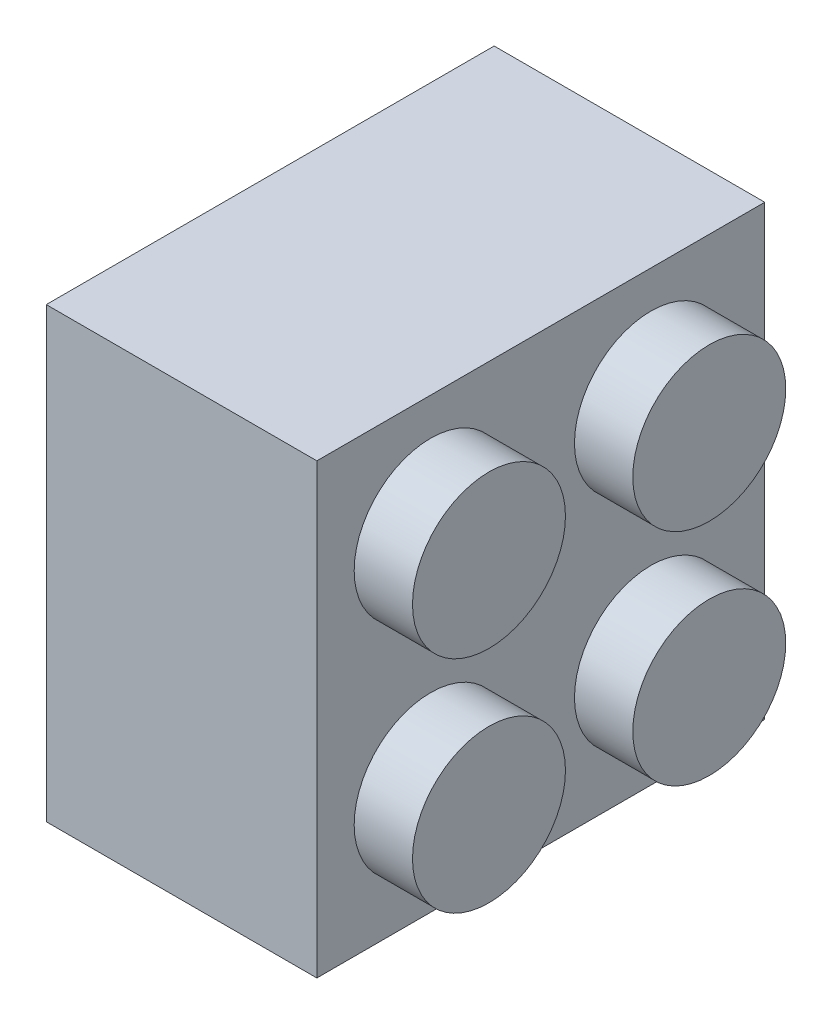
ISO-10303-21;
HEADER;
FILE_DESCRIPTION(('STEP AP214'),'2;1');
FILE_NAME('part.step','',(''),(''),'','','');
FILE_SCHEMA(('AUTOMOTIVE_DESIGN { 1 0 10303 214 1 1 1 1 }'));
ENDSEC;
DATA;
#1=APPLICATION_CONTEXT('core data for automotive mechanical design processes');
#2=APPLICATION_PROTOCOL_DEFINITION('international standard','automotive_design',2000,#1);
#3=PRODUCT_CONTEXT('',#1,'mechanical');
#4=PRODUCT('Part','Part','',(#3));
#5=PRODUCT_RELATED_PRODUCT_CATEGORY('part','',(#4));
#6=PRODUCT_DEFINITION_FORMATION('','',#4);
#7=PRODUCT_DEFINITION_CONTEXT('part definition',#1,'design');
#8=PRODUCT_DEFINITION('design','',#6,#7);
#9=PRODUCT_DEFINITION_SHAPE('','',#8);
#10=(LENGTH_UNIT() NAMED_UNIT(*) SI_UNIT(.MILLI.,.METRE.));
#11=(NAMED_UNIT(*) PLANE_ANGLE_UNIT() SI_UNIT($,.RADIAN.));
#12=(NAMED_UNIT(*) SI_UNIT($,.STERADIAN.) SOLID_ANGLE_UNIT());
#13=UNCERTAINTY_MEASURE_WITH_UNIT(LENGTH_MEASURE(1.E-05),#10,'distance_accuracy_value','');
#14=(GEOMETRIC_REPRESENTATION_CONTEXT(3) GLOBAL_UNCERTAINTY_ASSIGNED_CONTEXT((#13)) GLOBAL_UNIT_ASSIGNED_CONTEXT((#10,
#11,#12)) REPRESENTATION_CONTEXT('',''));
#15=CARTESIAN_POINT('',(0.,0.,0.));
#16=DIRECTION('',(0.,0.,1.));
#17=DIRECTION('',(1.,0.,0.));
#18=AXIS2_PLACEMENT_3D('',#15,#16,#17);
#19=CARTESIAN_POINT('',(0.,0.,0.));
#20=DIRECTION('',(1.,0.,0.));
#21=DIRECTION('',(0.,0.,-1.));
#22=AXIS2_PLACEMENT_3D('',#19,#20,#21);
#23=PLANE('',#22);
#24=DIRECTION('',(0.,1.,0.));
#25=VECTOR('',#24,1.);
#26=CARTESIAN_POINT('',(0.,-48.,-48.));
#27=LINE('',#26,#25);
#28=CARTESIAN_POINT('',(0.,-48.,-48.));
#29=VERTEX_POINT('',#28);
#30=CARTESIAN_POINT('',(0.,48.,-48.));
#31=VERTEX_POINT('',#30);
#32=EDGE_CURVE('E118',#29,#31,#27,.T.);
#33=ORIENTED_EDGE('',*,*,#32,.F.);
#34=DIRECTION('',(0.,0.,-1.));
#35=VECTOR('',#34,1.);
#36=CARTESIAN_POINT('',(0.,-48.,48.));
#37=LINE('',#36,#35);
#38=CARTESIAN_POINT('',(0.,-48.,48.));
#39=VERTEX_POINT('',#38);
#40=EDGE_CURVE('E195',#39,#29,#37,.T.);
#41=ORIENTED_EDGE('',*,*,#40,.F.);
#42=DIRECTION('',(0.,-1.,0.));
#43=VECTOR('',#42,1.);
#44=CARTESIAN_POINT('',(0.,48.,48.));
#45=LINE('',#44,#43);
#46=CARTESIAN_POINT('',(0.,48.,48.));
#47=VERTEX_POINT('',#46);
#48=EDGE_CURVE('E192',#47,#39,#45,.T.);
#49=ORIENTED_EDGE('',*,*,#48,.F.);
#50=DIRECTION('',(0.,0.,1.));
#51=VECTOR('',#50,1.);
#52=CARTESIAN_POINT('',(0.,48.,-48.));
#53=LINE('',#52,#51);
#54=EDGE_CURVE('E189',#31,#47,#53,.T.);
#55=ORIENTED_EDGE('',*,*,#54,.F.);
#56=EDGE_LOOP('',(#33,#41,#49,#55));
#57=FACE_BOUND('',#56,.T.);
#58=DIRECTION('',(0.,1.,0.));
#59=VECTOR('',#58,1.);
#60=CARTESIAN_POINT('',(0.,-40.,-40.));
#61=LINE('',#60,#59);
#62=CARTESIAN_POINT('',(0.,-40.,-40.));
#63=VERTEX_POINT('',#62);
#64=CARTESIAN_POINT('',(0.,40.,-40.));
#65=VERTEX_POINT('',#64);
#66=EDGE_CURVE('E65',#63,#65,#61,.T.);
#67=ORIENTED_EDGE('',*,*,#66,.T.);
#68=DIRECTION('',(0.,0.,1.));
#69=VECTOR('',#68,1.);
#70=CARTESIAN_POINT('',(0.,40.,-40.));
#71=LINE('',#70,#69);
#72=CARTESIAN_POINT('',(0.,40.,40.));
#73=VERTEX_POINT('',#72);
#74=EDGE_CURVE('E141',#65,#73,#71,.T.);
#75=ORIENTED_EDGE('',*,*,#74,.T.);
#76=DIRECTION('',(0.,-1.,0.));
#77=VECTOR('',#76,1.);
#78=CARTESIAN_POINT('',(0.,40.,40.));
#79=LINE('',#78,#77);
#80=CARTESIAN_POINT('',(0.,-40.,40.));
#81=VERTEX_POINT('',#80);
#82=EDGE_CURVE('E169',#73,#81,#79,.T.);
#83=ORIENTED_EDGE('',*,*,#82,.T.);
#84=DIRECTION('',(0.,0.,-1.));
#85=VECTOR('',#84,1.);
#86=CARTESIAN_POINT('',(0.,-40.,40.));
#87=LINE('',#86,#85);
#88=EDGE_CURVE('E155',#81,#63,#87,.T.);
#89=ORIENTED_EDGE('',*,*,#88,.T.);
#90=EDGE_LOOP('',(#67,#75,#83,#89));
#91=FACE_BOUND('',#90,.T.);
#92=ADVANCED_FACE('F41',(#57,#91),#23,.F.);
#93=CARTESIAN_POINT('',(48.,-48.,-48.));
#94=DIRECTION('',(0.,0.,1.));
#95=DIRECTION('',(1.,0.,0.));
#96=AXIS2_PLACEMENT_3D('',#93,#94,#95);
#97=PLANE('',#96);
#98=ORIENTED_EDGE('',*,*,#32,.T.);
#99=DIRECTION('',(-1.,0.,0.));
#100=VECTOR('',#99,1.);
#101=CARTESIAN_POINT('',(48.,48.,-48.));
#102=LINE('',#101,#100);
#103=CARTESIAN_POINT('',(58.,48.,-48.));
#104=VERTEX_POINT('',#103);
#105=EDGE_CURVE('E110',#104,#31,#102,.T.);
#106=ORIENTED_EDGE('',*,*,#105,.F.);
#107=DIRECTION('',(0.,1.,0.));
#108=VECTOR('',#107,1.);
#109=CARTESIAN_POINT('',(58.,48.,-48.));
#110=LINE('',#109,#108);
#111=CARTESIAN_POINT('',(58.,-48.,-48.));
#112=VERTEX_POINT('',#111);
#113=EDGE_CURVE('E115',#112,#104,#110,.T.);
#114=ORIENTED_EDGE('',*,*,#113,.F.);
#115=DIRECTION('',(-1.,0.,0.));
#116=VECTOR('',#115,1.);
#117=CARTESIAN_POINT('',(48.,-48.,-48.));
#118=LINE('',#117,#116);
#119=EDGE_CURVE('E198',#112,#29,#118,.T.);
#120=ORIENTED_EDGE('',*,*,#119,.T.);
#121=EDGE_LOOP('',(#98,#106,#114,#120));
#122=FACE_BOUND('',#121,.T.);
#123=ADVANCED_FACE('F112',(#122),#97,.F.);
#124=CARTESIAN_POINT('',(48.,48.,-48.));
#125=DIRECTION('',(0.,-1.,0.));
#126=DIRECTION('',(0.,0.,-1.));
#127=AXIS2_PLACEMENT_3D('',#124,#125,#126);
#128=PLANE('',#127);
#129=ORIENTED_EDGE('',*,*,#54,.T.);
#130=DIRECTION('',(-1.,0.,0.));
#131=VECTOR('',#130,1.);
#132=CARTESIAN_POINT('',(48.,48.,48.));
#133=LINE('',#132,#131);
#134=CARTESIAN_POINT('',(58.,48.,48.));
#135=VERTEX_POINT('',#134);
#136=EDGE_CURVE('E121',#135,#47,#133,.T.);
#137=ORIENTED_EDGE('',*,*,#136,.F.);
#138=DIRECTION('',(0.,0.,1.));
#139=VECTOR('',#138,1.);
#140=CARTESIAN_POINT('',(58.,48.,48.));
#141=LINE('',#140,#139);
#142=EDGE_CURVE('E124',#104,#135,#141,.T.);
#143=ORIENTED_EDGE('',*,*,#142,.F.);
#144=ORIENTED_EDGE('',*,*,#105,.T.);
#145=EDGE_LOOP('',(#129,#137,#143,#144));
#146=FACE_BOUND('',#145,.T.);
#147=ADVANCED_FACE('F125',(#146),#128,.F.);
#148=CARTESIAN_POINT('',(48.,48.,48.));
#149=DIRECTION('',(0.,0.,-1.));
#150=DIRECTION('',(-1.,0.,0.));
#151=AXIS2_PLACEMENT_3D('',#148,#149,#150);
#152=PLANE('',#151);
#153=ORIENTED_EDGE('',*,*,#48,.T.);
#154=DIRECTION('',(-1.,0.,0.));
#155=VECTOR('',#154,1.);
#156=CARTESIAN_POINT('',(48.,-48.,48.));
#157=LINE('',#156,#155);
#158=CARTESIAN_POINT('',(58.,-48.,48.));
#159=VERTEX_POINT('',#158);
#160=EDGE_CURVE('E201',#159,#39,#157,.T.);
#161=ORIENTED_EDGE('',*,*,#160,.F.);
#162=DIRECTION('',(0.,-1.,0.));
#163=VECTOR('',#162,1.);
#164=CARTESIAN_POINT('',(58.,48.,48.));
#165=LINE('',#164,#163);
#166=EDGE_CURVE('E131',#135,#159,#165,.T.);
#167=ORIENTED_EDGE('',*,*,#166,.F.);
#168=ORIENTED_EDGE('',*,*,#136,.T.);
#169=EDGE_LOOP('',(#153,#161,#167,#168));
#170=FACE_BOUND('',#169,.T.);
#171=ADVANCED_FACE('F243',(#170),#152,.F.);
#172=CARTESIAN_POINT('',(48.,-48.,48.));
#173=DIRECTION('',(0.,1.,0.));
#174=DIRECTION('',(0.,0.,1.));
#175=AXIS2_PLACEMENT_3D('',#172,#173,#174);
#176=PLANE('',#175);
#177=ORIENTED_EDGE('',*,*,#40,.T.);
#178=ORIENTED_EDGE('',*,*,#119,.F.);
#179=DIRECTION('',(0.,0.,-1.));
#180=VECTOR('',#179,1.);
#181=CARTESIAN_POINT('',(58.,-48.,48.));
#182=LINE('',#181,#180);
#183=EDGE_CURVE('E136',#159,#112,#182,.T.);
#184=ORIENTED_EDGE('',*,*,#183,.F.);
#185=ORIENTED_EDGE('',*,*,#160,.T.);
#186=EDGE_LOOP('',(#177,#178,#184,#185));
#187=FACE_BOUND('',#186,.T.);
#188=ADVANCED_FACE('F240',(#187),#176,.F.);
#189=CARTESIAN_POINT('',(48.,-40.,-40.));
#190=DIRECTION('',(0.,0.,1.));
#191=DIRECTION('',(1.,0.,0.));
#192=AXIS2_PLACEMENT_3D('',#189,#190,#191);
#193=PLANE('',#192);
#194=ORIENTED_EDGE('',*,*,#66,.F.);
#195=DIRECTION('',(-1.,0.,0.));
#196=VECTOR('',#195,1.);
#197=CARTESIAN_POINT('',(48.,-40.,-40.));
#198=LINE('',#197,#196);
#199=CARTESIAN_POINT('',(48.,-40.,-40.));
#200=VERTEX_POINT('',#199);
#201=EDGE_CURVE('E164',#200,#63,#198,.T.);
#202=ORIENTED_EDGE('',*,*,#201,.F.);
#203=DIRECTION('',(0.,1.,0.));
#204=VECTOR('',#203,1.);
#205=CARTESIAN_POINT('',(48.,-40.,-40.));
#206=LINE('',#205,#204);
#207=CARTESIAN_POINT('',(48.,40.,-40.));
#208=VERTEX_POINT('',#207);
#209=EDGE_CURVE('E150',#200,#208,#206,.T.);
#210=ORIENTED_EDGE('',*,*,#209,.T.);
#211=DIRECTION('',(-1.,0.,0.));
#212=VECTOR('',#211,1.);
#213=CARTESIAN_POINT('',(48.,40.,-40.));
#214=LINE('',#213,#212);
#215=EDGE_CURVE('E184',#208,#65,#214,.T.);
#216=ORIENTED_EDGE('',*,*,#215,.T.);
#217=EDGE_LOOP('',(#194,#202,#210,#216));
#218=FACE_BOUND('',#217,.T.);
#219=ADVANCED_FACE('F238',(#218),#193,.T.);
#220=CARTESIAN_POINT('',(48.,40.,-40.));
#221=DIRECTION('',(0.,-1.,0.));
#222=DIRECTION('',(0.,0.,-1.));
#223=AXIS2_PLACEMENT_3D('',#220,#221,#222);
#224=PLANE('',#223);
#225=ORIENTED_EDGE('',*,*,#74,.F.);
#226=ORIENTED_EDGE('',*,*,#215,.F.);
#227=DIRECTION('',(0.,0.,1.));
#228=VECTOR('',#227,1.);
#229=CARTESIAN_POINT('',(48.,40.,-40.));
#230=LINE('',#229,#228);
#231=CARTESIAN_POINT('',(48.,40.,40.));
#232=VERTEX_POINT('',#231);
#233=EDGE_CURVE('E154',#208,#232,#230,.T.);
#234=ORIENTED_EDGE('',*,*,#233,.T.);
#235=DIRECTION('',(-1.,0.,0.));
#236=VECTOR('',#235,1.);
#237=CARTESIAN_POINT('',(48.,40.,40.));
#238=LINE('',#237,#236);
#239=EDGE_CURVE('E181',#232,#73,#238,.T.);
#240=ORIENTED_EDGE('',*,*,#239,.T.);
#241=EDGE_LOOP('',(#225,#226,#234,#240));
#242=FACE_BOUND('',#241,.T.);
#243=ADVANCED_FACE('F267',(#242),#224,.T.);
#244=CARTESIAN_POINT('',(48.,40.,40.));
#245=DIRECTION('',(0.,0.,-1.));
#246=DIRECTION('',(-1.,0.,0.));
#247=AXIS2_PLACEMENT_3D('',#244,#245,#246);
#248=PLANE('',#247);
#249=ORIENTED_EDGE('',*,*,#82,.F.);
#250=ORIENTED_EDGE('',*,*,#239,.F.);
#251=DIRECTION('',(0.,-1.,0.));
#252=VECTOR('',#251,1.);
#253=CARTESIAN_POINT('',(48.,40.,40.));
#254=LINE('',#253,#252);
#255=CARTESIAN_POINT('',(48.,-40.,40.));
#256=VERTEX_POINT('',#255);
#257=EDGE_CURVE('E159',#232,#256,#254,.T.);
#258=ORIENTED_EDGE('',*,*,#257,.T.);
#259=DIRECTION('',(-1.,0.,0.));
#260=VECTOR('',#259,1.);
#261=CARTESIAN_POINT('',(48.,-40.,40.));
#262=LINE('',#261,#260);
#263=EDGE_CURVE('E178',#256,#81,#262,.T.);
#264=ORIENTED_EDGE('',*,*,#263,.T.);
#265=EDGE_LOOP('',(#249,#250,#258,#264));
#266=FACE_BOUND('',#265,.T.);
#267=ADVANCED_FACE('F273',(#266),#248,.T.);
#268=CARTESIAN_POINT('',(48.,-40.,40.));
#269=DIRECTION('',(0.,1.,0.));
#270=DIRECTION('',(0.,0.,1.));
#271=AXIS2_PLACEMENT_3D('',#268,#269,#270);
#272=PLANE('',#271);
#273=ORIENTED_EDGE('',*,*,#88,.F.);
#274=ORIENTED_EDGE('',*,*,#263,.F.);
#275=DIRECTION('',(0.,0.,-1.));
#276=VECTOR('',#275,1.);
#277=CARTESIAN_POINT('',(48.,-40.,40.));
#278=LINE('',#277,#276);
#279=EDGE_CURVE('E57',#256,#200,#278,.T.);
#280=ORIENTED_EDGE('',*,*,#279,.T.);
#281=ORIENTED_EDGE('',*,*,#201,.T.);
#282=EDGE_LOOP('',(#273,#274,#280,#281));
#283=FACE_BOUND('',#282,.T.);
#284=ADVANCED_FACE('F227',(#283),#272,.T.);
#285=CARTESIAN_POINT('',(48.,0.,0.));
#286=DIRECTION('',(1.,0.,0.));
#287=DIRECTION('',(0.,0.,-1.));
#288=AXIS2_PLACEMENT_3D('',#285,#286,#287);
#289=PLANE('',#288);
#290=CARTESIAN_POINT('',(48.,0.,0.));
#291=DIRECTION('',(1.,0.,0.));
#292=DIRECTION('',(0.,0.,-1.));
#293=AXIS2_PLACEMENT_3D('',#290,#291,#292);
#294=CIRCLE('',#293,22.6994558492444);
#295=CARTESIAN_POINT('',(48.,0.,-22.6994558492444));
#296=VERTEX_POINT('',#295);
#297=EDGE_CURVE('E12',#296,#296,#294,.T.);
#298=ORIENTED_EDGE('',*,*,#297,.T.);
#299=EDGE_LOOP('',(#298));
#300=FACE_BOUND('',#299,.T.);
#301=ORIENTED_EDGE('',*,*,#233,.F.);
#302=ORIENTED_EDGE('',*,*,#209,.F.);
#303=ORIENTED_EDGE('',*,*,#279,.F.);
#304=ORIENTED_EDGE('',*,*,#257,.F.);
#305=EDGE_LOOP('',(#301,#302,#303,#304));
#306=FACE_BOUND('',#305,.T.);
#307=ADVANCED_FACE('F216',(#300,#306),#289,.F.);
#308=CARTESIAN_POINT('',(58.,0.,0.));
#309=DIRECTION('',(1.,0.,0.));
#310=DIRECTION('',(0.,0.,-1.));
#311=AXIS2_PLACEMENT_3D('',#308,#309,#310);
#312=PLANE('',#311);
#313=CARTESIAN_POINT('',(58.,23.6080999106968,23.6080999106968));
#314=DIRECTION('',(1.,0.,0.));
#315=DIRECTION('',(0.,0.,-1.));
#316=AXIS2_PLACEMENT_3D('',#313,#314,#315);
#317=CIRCLE('',#316,16.3919000893032);
#318=CARTESIAN_POINT('',(58.,23.6080999106968,7.21619982139361));
#319=VERTEX_POINT('',#318);
#320=EDGE_CURVE('E450',#319,#319,#317,.T.);
#321=ORIENTED_EDGE('',*,*,#320,.F.);
#322=EDGE_LOOP('',(#321));
#323=FACE_BOUND('',#322,.T.);
#324=CARTESIAN_POINT('',(58.,-23.6080999106968,23.6080999106968));
#325=DIRECTION('',(1.,0.,0.));
#326=DIRECTION('',(0.,0.,-1.));
#327=AXIS2_PLACEMENT_3D('',#324,#325,#326);
#328=CIRCLE('',#327,16.3919000893032);
#329=CARTESIAN_POINT('',(58.,-23.6080999106968,7.2161998213936));
#330=VERTEX_POINT('',#329);
#331=EDGE_CURVE('E457',#330,#330,#328,.T.);
#332=ORIENTED_EDGE('',*,*,#331,.F.);
#333=EDGE_LOOP('',(#332));
#334=FACE_BOUND('',#333,.T.);
#335=CARTESIAN_POINT('',(58.,-23.6080999106968,-23.6080999106968));
#336=DIRECTION('',(1.,0.,0.));
#337=DIRECTION('',(0.,0.,-1.));
#338=AXIS2_PLACEMENT_3D('',#335,#336,#337);
#339=CIRCLE('',#338,16.3919000893032);
#340=CARTESIAN_POINT('',(58.,-23.6080999106968,-40.));
#341=VERTEX_POINT('',#340);
#342=EDGE_CURVE('E465',#341,#341,#339,.T.);
#343=ORIENTED_EDGE('',*,*,#342,.F.);
#344=EDGE_LOOP('',(#343));
#345=FACE_BOUND('',#344,.T.);
#346=CARTESIAN_POINT('',(58.,23.6080999106968,-23.6080999106968));
#347=DIRECTION('',(1.,0.,0.));
#348=DIRECTION('',(0.,0.,-1.));
#349=AXIS2_PLACEMENT_3D('',#346,#347,#348);
#350=CIRCLE('',#349,16.3919000893032);
#351=CARTESIAN_POINT('',(58.,23.6080999106968,-40.));
#352=VERTEX_POINT('',#351);
#353=EDGE_CURVE('E145',#352,#352,#350,.T.);
#354=ORIENTED_EDGE('',*,*,#353,.F.);
#355=EDGE_LOOP('',(#354));
#356=FACE_BOUND('',#355,.T.);
#357=ORIENTED_EDGE('',*,*,#142,.T.);
#358=ORIENTED_EDGE('',*,*,#166,.T.);
#359=ORIENTED_EDGE('',*,*,#183,.T.);
#360=ORIENTED_EDGE('',*,*,#113,.T.);
#361=EDGE_LOOP('',(#357,#358,#359,#360));
#362=FACE_BOUND('',#361,.T.);
#363=ADVANCED_FACE('F134',(#323,#334,#345,#356,#362),#312,.T.);
#364=CARTESIAN_POINT('',(70.5,23.6080999106968,-23.6080999106968));
#365=DIRECTION('',(-1.,0.,0.));
#366=DIRECTION('',(0.,0.,1.));
#367=AXIS2_PLACEMENT_3D('',#364,#365,#366);
#368=CYLINDRICAL_SURFACE('',#367,16.3919000893032);
#369=CARTESIAN_POINT('',(70.5,23.6080999106968,-23.6080999106968));
#370=DIRECTION('',(1.,0.,0.));
#371=DIRECTION('',(0.,0.,-1.));
#372=AXIS2_PLACEMENT_3D('',#369,#370,#371);
#373=CIRCLE('',#372,16.3919000893032);
#374=CARTESIAN_POINT('',(70.5,23.6080999106968,-40.));
#375=VERTEX_POINT('',#374);
#376=EDGE_CURVE('E132',#375,#375,#373,.T.);
#377=ORIENTED_EDGE('',*,*,#376,.F.);
#378=EDGE_LOOP('',(#377));
#379=FACE_BOUND('',#378,.T.);
#380=ORIENTED_EDGE('',*,*,#353,.T.);
#381=EDGE_LOOP('',(#380));
#382=FACE_BOUND('',#381,.T.);
#383=ADVANCED_FACE('F299',(#379,#382),#368,.T.);
#384=CARTESIAN_POINT('',(70.5,23.6080999106968,-23.6080999106968));
#385=DIRECTION('',(1.,0.,0.));
#386=DIRECTION('',(0.,0.,-1.));
#387=AXIS2_PLACEMENT_3D('',#384,#385,#386);
#388=PLANE('',#387);
#389=ORIENTED_EDGE('',*,*,#376,.T.);
#390=EDGE_LOOP('',(#389));
#391=FACE_BOUND('',#390,.T.);
#392=ADVANCED_FACE('F306',(#391),#388,.T.);
#393=CARTESIAN_POINT('',(70.5,-23.6080999106968,-23.6080999106968));
#394=DIRECTION('',(-1.,0.,0.));
#395=DIRECTION('',(0.,0.,1.));
#396=AXIS2_PLACEMENT_3D('',#393,#394,#395);
#397=CYLINDRICAL_SURFACE('',#396,16.3919000893032);
#398=CARTESIAN_POINT('',(70.5,-23.6080999106968,-23.6080999106968));
#399=DIRECTION('',(1.,0.,0.));
#400=DIRECTION('',(0.,0.,-1.));
#401=AXIS2_PLACEMENT_3D('',#398,#399,#400);
#402=CIRCLE('',#401,16.3919000893032);
#403=CARTESIAN_POINT('',(70.5,-23.6080999106968,-40.));
#404=VERTEX_POINT('',#403);
#405=EDGE_CURVE('E469',#404,#404,#402,.T.);
#406=ORIENTED_EDGE('',*,*,#405,.F.);
#407=EDGE_LOOP('',(#406));
#408=FACE_BOUND('',#407,.T.);
#409=ORIENTED_EDGE('',*,*,#342,.T.);
#410=EDGE_LOOP('',(#409));
#411=FACE_BOUND('',#410,.T.);
#412=ADVANCED_FACE('F313',(#408,#411),#397,.T.);
#413=CARTESIAN_POINT('',(70.5,-23.6080999106968,-23.6080999106968));
#414=DIRECTION('',(1.,0.,0.));
#415=DIRECTION('',(0.,0.,-1.));
#416=AXIS2_PLACEMENT_3D('',#413,#414,#415);
#417=PLANE('',#416);
#418=ORIENTED_EDGE('',*,*,#405,.T.);
#419=EDGE_LOOP('',(#418));
#420=FACE_BOUND('',#419,.T.);
#421=ADVANCED_FACE('F321',(#420),#417,.T.);
#422=CARTESIAN_POINT('',(70.5,-23.6080999106968,23.6080999106968));
#423=DIRECTION('',(-1.,0.,0.));
#424=DIRECTION('',(0.,0.,1.));
#425=AXIS2_PLACEMENT_3D('',#422,#423,#424);
#426=CYLINDRICAL_SURFACE('',#425,16.3919000893032);
#427=CARTESIAN_POINT('',(70.5,-23.6080999106968,23.6080999106968));
#428=DIRECTION('',(1.,0.,0.));
#429=DIRECTION('',(0.,0.,-1.));
#430=AXIS2_PLACEMENT_3D('',#427,#428,#429);
#431=CIRCLE('',#430,16.3919000893032);
#432=CARTESIAN_POINT('',(70.5,-23.6080999106968,7.2161998213936));
#433=VERTEX_POINT('',#432);
#434=EDGE_CURVE('E461',#433,#433,#431,.T.);
#435=ORIENTED_EDGE('',*,*,#434,.F.);
#436=EDGE_LOOP('',(#435));
#437=FACE_BOUND('',#436,.T.);
#438=ORIENTED_EDGE('',*,*,#331,.T.);
#439=EDGE_LOOP('',(#438));
#440=FACE_BOUND('',#439,.T.);
#441=ADVANCED_FACE('F329',(#437,#440),#426,.T.);
#442=CARTESIAN_POINT('',(70.5,-23.6080999106968,23.6080999106968));
#443=DIRECTION('',(1.,0.,0.));
#444=DIRECTION('',(0.,0.,-1.));
#445=AXIS2_PLACEMENT_3D('',#442,#443,#444);
#446=PLANE('',#445);
#447=ORIENTED_EDGE('',*,*,#434,.T.);
#448=EDGE_LOOP('',(#447));
#449=FACE_BOUND('',#448,.T.);
#450=ADVANCED_FACE('F337',(#449),#446,.T.);
#451=CARTESIAN_POINT('',(70.5,23.6080999106968,23.6080999106968));
#452=DIRECTION('',(-1.,0.,0.));
#453=DIRECTION('',(0.,0.,1.));
#454=AXIS2_PLACEMENT_3D('',#451,#452,#453);
#455=CYLINDRICAL_SURFACE('',#454,16.3919000893032);
#456=CARTESIAN_POINT('',(70.5,23.6080999106968,23.6080999106968));
#457=DIRECTION('',(1.,0.,0.));
#458=DIRECTION('',(0.,0.,-1.));
#459=AXIS2_PLACEMENT_3D('',#456,#457,#458);
#460=CIRCLE('',#459,16.3919000893032);
#461=CARTESIAN_POINT('',(70.5,23.6080999106968,7.21619982139361));
#462=VERTEX_POINT('',#461);
#463=EDGE_CURVE('E453',#462,#462,#460,.T.);
#464=ORIENTED_EDGE('',*,*,#463,.F.);
#465=EDGE_LOOP('',(#464));
#466=FACE_BOUND('',#465,.T.);
#467=ORIENTED_EDGE('',*,*,#320,.T.);
#468=EDGE_LOOP('',(#467));
#469=FACE_BOUND('',#468,.T.);
#470=ADVANCED_FACE('F345',(#466,#469),#455,.T.);
#471=CARTESIAN_POINT('',(70.5,23.6080999106968,23.6080999106968));
#472=DIRECTION('',(1.,0.,0.));
#473=DIRECTION('',(0.,0.,-1.));
#474=AXIS2_PLACEMENT_3D('',#471,#472,#473);
#475=PLANE('',#474);
#476=ORIENTED_EDGE('',*,*,#463,.T.);
#477=EDGE_LOOP('',(#476));
#478=FACE_BOUND('',#477,.T.);
#479=ADVANCED_FACE('F353',(#478),#475,.T.);
#480=CARTESIAN_POINT('',(100.325901807805,0.,0.));
#481=DIRECTION('',(-1.,0.,0.));
#482=DIRECTION('',(0.,0.,1.));
#483=AXIS2_PLACEMENT_3D('',#480,#481,#482);
#484=CYLINDRICAL_SURFACE('',#483,11.5);
#485=CARTESIAN_POINT('',(0.,0.,0.));
#486=DIRECTION('',(-1.,0.,0.));
#487=DIRECTION('',(0.,0.,1.));
#488=AXIS2_PLACEMENT_3D('',#485,#486,#487);
#489=CIRCLE('',#488,11.5);
#490=CARTESIAN_POINT('',(0.,0.,11.5));
#491=VERTEX_POINT('',#490);
#492=EDGE_CURVE('E444',#491,#491,#489,.T.);
#493=ORIENTED_EDGE('',*,*,#492,.T.);
#494=EDGE_LOOP('',(#493));
#495=FACE_BOUND('',#494,.T.);
#496=CARTESIAN_POINT('',(48.,0.,0.));
#497=DIRECTION('',(1.,0.,0.));
#498=DIRECTION('',(0.,0.,-1.));
#499=AXIS2_PLACEMENT_3D('',#496,#497,#498);
#500=CIRCLE('',#499,11.5);
#501=CARTESIAN_POINT('',(48.,0.,-11.5));
#502=VERTEX_POINT('',#501);
#503=EDGE_CURVE('E50',#502,#502,#500,.T.);
#504=ORIENTED_EDGE('',*,*,#503,.T.);
#505=EDGE_LOOP('',(#504));
#506=FACE_BOUND('',#505,.T.);
#507=ADVANCED_FACE('F210',(#495,#506),#484,.F.);
#508=CARTESIAN_POINT('',(0.,0.,0.));
#509=DIRECTION('',(-1.,0.,0.));
#510=DIRECTION('',(0.,0.,1.));
#511=AXIS2_PLACEMENT_3D('',#508,#509,#510);
#512=PLANE('',#511);
#513=ORIENTED_EDGE('',*,*,#492,.F.);
#514=EDGE_LOOP('',(#513));
#515=FACE_BOUND('',#514,.T.);
#516=CARTESIAN_POINT('',(0.,0.,0.));
#517=DIRECTION('',(-1.,0.,0.));
#518=DIRECTION('',(0.,0.,1.));
#519=AXIS2_PLACEMENT_3D('',#516,#517,#518);
#520=CIRCLE('',#519,18.5);
#521=CARTESIAN_POINT('',(0.,0.,18.5));
#522=VERTEX_POINT('',#521);
#523=EDGE_CURVE('E446',#522,#522,#520,.T.);
#524=ORIENTED_EDGE('',*,*,#523,.T.);
#525=EDGE_LOOP('',(#524));
#526=FACE_BOUND('',#525,.T.);
#527=ADVANCED_FACE('F214',(#515,#526),#512,.T.);
#528=ORIENTED_EDGE('',*,*,#503,.F.);
#529=EDGE_LOOP('',(#528));
#530=FACE_BOUND('',#529,.T.);
#531=ADVANCED_FACE('F212',(#530),#289,.F.);
#532=CARTESIAN_POINT('',(1.76247905159244E-12,0.,0.));
#533=DIRECTION('',(1.,0.,0.));
#534=DIRECTION('',(0.,0.,-1.));
#535=AXIS2_PLACEMENT_3D('',#532,#533,#534);
#536=CONICAL_SURFACE('',#535,18.5,0.0872664625997202);
#537=ORIENTED_EDGE('',*,*,#297,.F.);
#538=EDGE_LOOP('',(#537));
#539=FACE_BOUND('',#538,.T.);
#540=ORIENTED_EDGE('',*,*,#523,.F.);
#541=EDGE_LOOP('',(#540));
#542=FACE_BOUND('',#541,.T.);
#543=ADVANCED_FACE('F43',(#539,#542),#536,.T.);
#544=CLOSED_SHELL('',(#92,#123,#147,#171,#188,#219,#243,#267,#284,#307,#363,#383,#392,#412,#421,
#441,#450,#470,#479,#507,#527,#531,#543));
#545=MANIFOLD_SOLID_BREP('B2',#544);
#546=ADVANCED_BREP_SHAPE_REPRESENTATION('',(#18,#545),#14);
#547=SHAPE_DEFINITION_REPRESENTATION(#9,#546);
ENDSEC;
END-ISO-10303-21;
